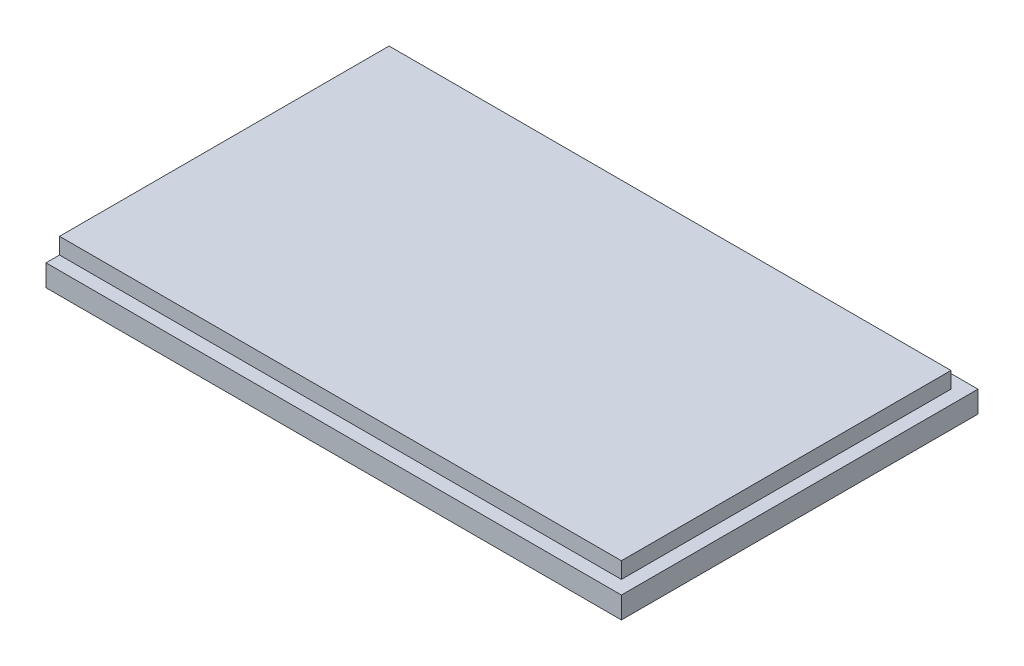
ISO-10303-21;
HEADER;
FILE_DESCRIPTION(('STEP AP214'),'2;1');
FILE_NAME('part.step','',(''),(''),'','','');
FILE_SCHEMA(('AUTOMOTIVE_DESIGN { 1 0 10303 214 1 1 1 1 }'));
ENDSEC;
DATA;
#1=APPLICATION_CONTEXT('core data for automotive mechanical design processes');
#2=APPLICATION_PROTOCOL_DEFINITION('international standard','automotive_design',2000,#1);
#3=PRODUCT_CONTEXT('',#1,'mechanical');
#4=PRODUCT('Part','Part','',(#3));
#5=PRODUCT_RELATED_PRODUCT_CATEGORY('part','',(#4));
#6=PRODUCT_DEFINITION_FORMATION('','',#4);
#7=PRODUCT_DEFINITION_CONTEXT('part definition',#1,'design');
#8=PRODUCT_DEFINITION('design','',#6,#7);
#9=PRODUCT_DEFINITION_SHAPE('','',#8);
#10=(LENGTH_UNIT() NAMED_UNIT(*) SI_UNIT(.MILLI.,.METRE.));
#11=(NAMED_UNIT(*) PLANE_ANGLE_UNIT() SI_UNIT($,.RADIAN.));
#12=(NAMED_UNIT(*) SI_UNIT($,.STERADIAN.) SOLID_ANGLE_UNIT());
#13=UNCERTAINTY_MEASURE_WITH_UNIT(LENGTH_MEASURE(1.E-05),#10,'distance_accuracy_value','');
#14=(GEOMETRIC_REPRESENTATION_CONTEXT(3) GLOBAL_UNCERTAINTY_ASSIGNED_CONTEXT((#13)) GLOBAL_UNIT_ASSIGNED_CONTEXT((#10,
#11,#12)) REPRESENTATION_CONTEXT('',''));
#15=CARTESIAN_POINT('',(0.,0.,0.));
#16=DIRECTION('',(0.,0.,1.));
#17=DIRECTION('',(1.,0.,0.));
#18=AXIS2_PLACEMENT_3D('',#15,#16,#17);
#19=CARTESIAN_POINT('',(21.3,1.6,-13.2));
#20=DIRECTION('',(-1.,0.,0.));
#21=DIRECTION('',(0.,0.,1.));
#22=AXIS2_PLACEMENT_3D('',#19,#20,#21);
#23=PLANE('',#22);
#24=DIRECTION('',(0.,0.,-1.));
#25=VECTOR('',#24,1.);
#26=CARTESIAN_POINT('',(21.3,0.,-13.2));
#27=LINE('',#26,#25);
#28=CARTESIAN_POINT('',(21.3,0.,13.2));
#29=VERTEX_POINT('',#28);
#30=CARTESIAN_POINT('',(21.3,0.,-13.2));
#31=VERTEX_POINT('',#30);
#32=EDGE_CURVE('E123',#29,#31,#27,.T.);
#33=ORIENTED_EDGE('',*,*,#32,.T.);
#34=DIRECTION('',(0.,-1.,0.));
#35=VECTOR('',#34,1.);
#36=CARTESIAN_POINT('',(21.3,1.6,-13.2));
#37=LINE('',#36,#35);
#38=CARTESIAN_POINT('',(21.3,1.6,-13.2));
#39=VERTEX_POINT('',#38);
#40=EDGE_CURVE('E11',#39,#31,#37,.T.);
#41=ORIENTED_EDGE('',*,*,#40,.F.);
#42=DIRECTION('',(0.,0.,-1.));
#43=VECTOR('',#42,1.);
#44=CARTESIAN_POINT('',(21.3,1.6,-13.2));
#45=LINE('',#44,#43);
#46=CARTESIAN_POINT('',(21.3,1.6,13.2));
#47=VERTEX_POINT('',#46);
#48=EDGE_CURVE('E132',#47,#39,#45,.T.);
#49=ORIENTED_EDGE('',*,*,#48,.F.);
#50=DIRECTION('',(0.,-1.,0.));
#51=VECTOR('',#50,1.);
#52=CARTESIAN_POINT('',(21.3,1.6,13.2));
#53=LINE('',#52,#51);
#54=EDGE_CURVE('E141',#47,#29,#53,.T.);
#55=ORIENTED_EDGE('',*,*,#54,.T.);
#56=EDGE_LOOP('',(#33,#41,#49,#55));
#57=FACE_BOUND('',#56,.T.);
#58=ADVANCED_FACE('F37',(#57),#23,.F.);
#59=CARTESIAN_POINT('',(-21.3,1.6,-13.2));
#60=DIRECTION('',(0.,0.,1.));
#61=DIRECTION('',(1.,0.,0.));
#62=AXIS2_PLACEMENT_3D('',#59,#60,#61);
#63=PLANE('',#62);
#64=DIRECTION('',(-1.,0.,0.));
#65=VECTOR('',#64,1.);
#66=CARTESIAN_POINT('',(-21.3,0.,-13.2));
#67=LINE('',#66,#65);
#68=CARTESIAN_POINT('',(-21.3,0.,-13.2));
#69=VERTEX_POINT('',#68);
#70=EDGE_CURVE('E126',#31,#69,#67,.T.);
#71=ORIENTED_EDGE('',*,*,#70,.T.);
#72=DIRECTION('',(0.,-1.,0.));
#73=VECTOR('',#72,1.);
#74=CARTESIAN_POINT('',(-21.3,1.6,-13.2));
#75=LINE('',#74,#73);
#76=CARTESIAN_POINT('',(-21.3,1.6,-13.2));
#77=VERTEX_POINT('',#76);
#78=EDGE_CURVE('E44',#77,#69,#75,.T.);
#79=ORIENTED_EDGE('',*,*,#78,.F.);
#80=DIRECTION('',(-1.,0.,0.));
#81=VECTOR('',#80,1.);
#82=CARTESIAN_POINT('',(-21.3,1.6,-13.2));
#83=LINE('',#82,#81);
#84=EDGE_CURVE('E135',#39,#77,#83,.T.);
#85=ORIENTED_EDGE('',*,*,#84,.F.);
#86=ORIENTED_EDGE('',*,*,#40,.T.);
#87=EDGE_LOOP('',(#71,#79,#85,#86));
#88=FACE_BOUND('',#87,.T.);
#89=ADVANCED_FACE('F168',(#88),#63,.F.);
#90=CARTESIAN_POINT('',(-21.3,1.6,-13.2));
#91=DIRECTION('',(1.,0.,0.));
#92=DIRECTION('',(0.,0.,-1.));
#93=AXIS2_PLACEMENT_3D('',#90,#91,#92);
#94=PLANE('',#93);
#95=DIRECTION('',(0.,0.,1.));
#96=VECTOR('',#95,1.);
#97=CARTESIAN_POINT('',(-21.3,0.,-13.2));
#98=LINE('',#97,#96);
#99=CARTESIAN_POINT('',(-21.3,0.,13.2));
#100=VERTEX_POINT('',#99);
#101=EDGE_CURVE('E144',#69,#100,#98,.T.);
#102=ORIENTED_EDGE('',*,*,#101,.T.);
#103=DIRECTION('',(0.,-1.,0.));
#104=VECTOR('',#103,1.);
#105=CARTESIAN_POINT('',(-21.3,1.6,13.2));
#106=LINE('',#105,#104);
#107=CARTESIAN_POINT('',(-21.3,1.6,13.2));
#108=VERTEX_POINT('',#107);
#109=EDGE_CURVE('E149',#108,#100,#106,.T.);
#110=ORIENTED_EDGE('',*,*,#109,.F.);
#111=DIRECTION('',(0.,0.,1.));
#112=VECTOR('',#111,1.);
#113=CARTESIAN_POINT('',(-21.3,1.6,-13.2));
#114=LINE('',#113,#112);
#115=CARTESIAN_POINT('',(-21.3,1.6,12.2));
#116=VERTEX_POINT('',#115);
#117=EDGE_CURVE('E122',#116,#108,#114,.T.);
#118=ORIENTED_EDGE('',*,*,#117,.F.);
#119=DIRECTION('',(0.,-1.,0.));
#120=VECTOR('',#119,1.);
#121=CARTESIAN_POINT('',(-21.3,2.8,12.2));
#122=LINE('',#121,#120);
#123=CARTESIAN_POINT('',(-21.3,2.8,12.2));
#124=VERTEX_POINT('',#123);
#125=EDGE_CURVE('E104',#124,#116,#122,.T.);
#126=ORIENTED_EDGE('',*,*,#125,.F.);
#127=DIRECTION('',(0.,0.,1.));
#128=VECTOR('',#127,1.);
#129=CARTESIAN_POINT('',(-21.3,2.8,-12.2));
#130=LINE('',#129,#128);
#131=CARTESIAN_POINT('',(-21.3,2.8,-12.2));
#132=VERTEX_POINT('',#131);
#133=EDGE_CURVE('E110',#132,#124,#130,.T.);
#134=ORIENTED_EDGE('',*,*,#133,.F.);
#135=DIRECTION('',(0.,-1.,0.));
#136=VECTOR('',#135,1.);
#137=CARTESIAN_POINT('',(-21.3,2.8,-12.2));
#138=LINE('',#137,#136);
#139=CARTESIAN_POINT('',(-21.3,1.6,-12.2));
#140=VERTEX_POINT('',#139);
#141=EDGE_CURVE('E275',#132,#140,#138,.T.);
#142=ORIENTED_EDGE('',*,*,#141,.T.);
#143=EDGE_CURVE('E138',#77,#140,#114,.T.);
#144=ORIENTED_EDGE('',*,*,#143,.F.);
#145=ORIENTED_EDGE('',*,*,#78,.T.);
#146=EDGE_LOOP('',(#102,#110,#118,#126,#134,#142,#144,#145));
#147=FACE_BOUND('',#146,.T.);
#148=ADVANCED_FACE('F120',(#147),#94,.F.);
#149=CARTESIAN_POINT('',(-21.3,1.6,13.2));
#150=DIRECTION('',(0.,0.,-1.));
#151=DIRECTION('',(-1.,0.,0.));
#152=AXIS2_PLACEMENT_3D('',#149,#150,#151);
#153=PLANE('',#152);
#154=DIRECTION('',(1.,0.,0.));
#155=VECTOR('',#154,1.);
#156=CARTESIAN_POINT('',(-21.3,0.,13.2));
#157=LINE('',#156,#155);
#158=EDGE_CURVE('E136',#100,#29,#157,.T.);
#159=ORIENTED_EDGE('',*,*,#158,.T.);
#160=ORIENTED_EDGE('',*,*,#54,.F.);
#161=DIRECTION('',(1.,0.,0.));
#162=VECTOR('',#161,1.);
#163=CARTESIAN_POINT('',(-21.3,1.6,13.2));
#164=LINE('',#163,#162);
#165=EDGE_CURVE('E140',#108,#47,#164,.T.);
#166=ORIENTED_EDGE('',*,*,#165,.F.);
#167=ORIENTED_EDGE('',*,*,#109,.T.);
#168=EDGE_LOOP('',(#159,#160,#166,#167));
#169=FACE_BOUND('',#168,.T.);
#170=ADVANCED_FACE('F162',(#169),#153,.F.);
#171=CARTESIAN_POINT('',(0.,1.6,0.));
#172=DIRECTION('',(0.,1.,0.));
#173=DIRECTION('',(0.,0.,1.));
#174=AXIS2_PLACEMENT_3D('',#171,#172,#173);
#175=PLANE('',#174);
#176=DIRECTION('',(-1.,0.,0.));
#177=VECTOR('',#176,1.);
#178=CARTESIAN_POINT('',(-21.3,1.6,-12.2));
#179=LINE('',#178,#177);
#180=CARTESIAN_POINT('',(20.3,1.6,-12.2));
#181=VERTEX_POINT('',#180);
#182=EDGE_CURVE('E51',#181,#140,#179,.T.);
#183=ORIENTED_EDGE('',*,*,#182,.F.);
#184=DIRECTION('',(0.,0.,-1.));
#185=VECTOR('',#184,1.);
#186=CARTESIAN_POINT('',(20.3,1.6,-12.2));
#187=LINE('',#186,#185);
#188=CARTESIAN_POINT('',(20.3,1.6,12.2));
#189=VERTEX_POINT('',#188);
#190=EDGE_CURVE('E277',#189,#181,#187,.T.);
#191=ORIENTED_EDGE('',*,*,#190,.F.);
#192=DIRECTION('',(1.,0.,0.));
#193=VECTOR('',#192,1.);
#194=CARTESIAN_POINT('',(-21.3,1.6,12.2));
#195=LINE('',#194,#193);
#196=EDGE_CURVE('E57',#116,#189,#195,.T.);
#197=ORIENTED_EDGE('',*,*,#196,.F.);
#198=ORIENTED_EDGE('',*,*,#117,.T.);
#199=ORIENTED_EDGE('',*,*,#165,.T.);
#200=ORIENTED_EDGE('',*,*,#48,.T.);
#201=ORIENTED_EDGE('',*,*,#84,.T.);
#202=ORIENTED_EDGE('',*,*,#143,.T.);
#203=EDGE_LOOP('',(#183,#191,#197,#198,#199,#200,#201,#202));
#204=FACE_BOUND('',#203,.T.);
#205=ADVANCED_FACE('F167',(#204),#175,.T.);
#206=CARTESIAN_POINT('',(0.,0.,0.));
#207=DIRECTION('',(0.,1.,0.));
#208=DIRECTION('',(0.,0.,1.));
#209=AXIS2_PLACEMENT_3D('',#206,#207,#208);
#210=PLANE('',#209);
#211=ORIENTED_EDGE('',*,*,#32,.F.);
#212=ORIENTED_EDGE('',*,*,#158,.F.);
#213=ORIENTED_EDGE('',*,*,#101,.F.);
#214=ORIENTED_EDGE('',*,*,#70,.F.);
#215=EDGE_LOOP('',(#211,#212,#213,#214));
#216=FACE_BOUND('',#215,.T.);
#217=ADVANCED_FACE('F159',(#216),#210,.F.);
#218=CARTESIAN_POINT('',(-21.3,2.8,12.2));
#219=DIRECTION('',(0.,0.,-1.));
#220=DIRECTION('',(-1.,0.,0.));
#221=AXIS2_PLACEMENT_3D('',#218,#219,#220);
#222=PLANE('',#221);
#223=ORIENTED_EDGE('',*,*,#196,.T.);
#224=DIRECTION('',(0.,-1.,0.));
#225=VECTOR('',#224,1.);
#226=CARTESIAN_POINT('',(20.3,2.8,12.2));
#227=LINE('',#226,#225);
#228=CARTESIAN_POINT('',(20.3,2.8,12.2));
#229=VERTEX_POINT('',#228);
#230=EDGE_CURVE('E106',#229,#189,#227,.T.);
#231=ORIENTED_EDGE('',*,*,#230,.F.);
#232=DIRECTION('',(1.,0.,0.));
#233=VECTOR('',#232,1.);
#234=CARTESIAN_POINT('',(-21.3,2.8,12.2));
#235=LINE('',#234,#233);
#236=EDGE_CURVE('E100',#124,#229,#235,.T.);
#237=ORIENTED_EDGE('',*,*,#236,.F.);
#238=ORIENTED_EDGE('',*,*,#125,.T.);
#239=EDGE_LOOP('',(#223,#231,#237,#238));
#240=FACE_BOUND('',#239,.T.);
#241=ADVANCED_FACE('F102',(#240),#222,.F.);
#242=CARTESIAN_POINT('',(20.3,2.8,-12.2));
#243=DIRECTION('',(-1.,0.,0.));
#244=DIRECTION('',(0.,0.,1.));
#245=AXIS2_PLACEMENT_3D('',#242,#243,#244);
#246=PLANE('',#245);
#247=ORIENTED_EDGE('',*,*,#190,.T.);
#248=DIRECTION('',(0.,-1.,0.));
#249=VECTOR('',#248,1.);
#250=CARTESIAN_POINT('',(20.3,2.8,-12.2));
#251=LINE('',#250,#249);
#252=CARTESIAN_POINT('',(20.3,2.8,-12.2));
#253=VERTEX_POINT('',#252);
#254=EDGE_CURVE('E128',#253,#181,#251,.T.);
#255=ORIENTED_EDGE('',*,*,#254,.F.);
#256=DIRECTION('',(0.,0.,-1.));
#257=VECTOR('',#256,1.);
#258=CARTESIAN_POINT('',(20.3,2.8,-12.2));
#259=LINE('',#258,#257);
#260=EDGE_CURVE('E109',#229,#253,#259,.T.);
#261=ORIENTED_EDGE('',*,*,#260,.F.);
#262=ORIENTED_EDGE('',*,*,#230,.T.);
#263=EDGE_LOOP('',(#247,#255,#261,#262));
#264=FACE_BOUND('',#263,.T.);
#265=ADVANCED_FACE('F184',(#264),#246,.F.);
#266=CARTESIAN_POINT('',(-21.3,2.8,-12.2));
#267=DIRECTION('',(0.,0.,1.));
#268=DIRECTION('',(1.,0.,0.));
#269=AXIS2_PLACEMENT_3D('',#266,#267,#268);
#270=PLANE('',#269);
#271=ORIENTED_EDGE('',*,*,#182,.T.);
#272=ORIENTED_EDGE('',*,*,#141,.F.);
#273=DIRECTION('',(-1.,0.,0.));
#274=VECTOR('',#273,1.);
#275=CARTESIAN_POINT('',(-21.3,2.8,-12.2));
#276=LINE('',#275,#274);
#277=EDGE_CURVE('E115',#253,#132,#276,.T.);
#278=ORIENTED_EDGE('',*,*,#277,.F.);
#279=ORIENTED_EDGE('',*,*,#254,.T.);
#280=EDGE_LOOP('',(#271,#272,#278,#279));
#281=FACE_BOUND('',#280,.T.);
#282=ADVANCED_FACE('F187',(#281),#270,.F.);
#283=CARTESIAN_POINT('',(0.,2.8,0.));
#284=DIRECTION('',(0.,1.,0.));
#285=DIRECTION('',(0.,0.,1.));
#286=AXIS2_PLACEMENT_3D('',#283,#284,#285);
#287=PLANE('',#286);
#288=ORIENTED_EDGE('',*,*,#133,.T.);
#289=ORIENTED_EDGE('',*,*,#236,.T.);
#290=ORIENTED_EDGE('',*,*,#260,.T.);
#291=ORIENTED_EDGE('',*,*,#277,.T.);
#292=EDGE_LOOP('',(#288,#289,#290,#291));
#293=FACE_BOUND('',#292,.T.);
#294=ADVANCED_FACE('F113',(#293),#287,.T.);
#295=CLOSED_SHELL('',(#58,#89,#148,#170,#205,#217,#241,#265,#282,#294));
#296=MANIFOLD_SOLID_BREP('B2',#295);
#297=ADVANCED_BREP_SHAPE_REPRESENTATION('',(#18,#296),#14);
#298=SHAPE_DEFINITION_REPRESENTATION(#9,#297);
ENDSEC;
END-ISO-10303-21;
